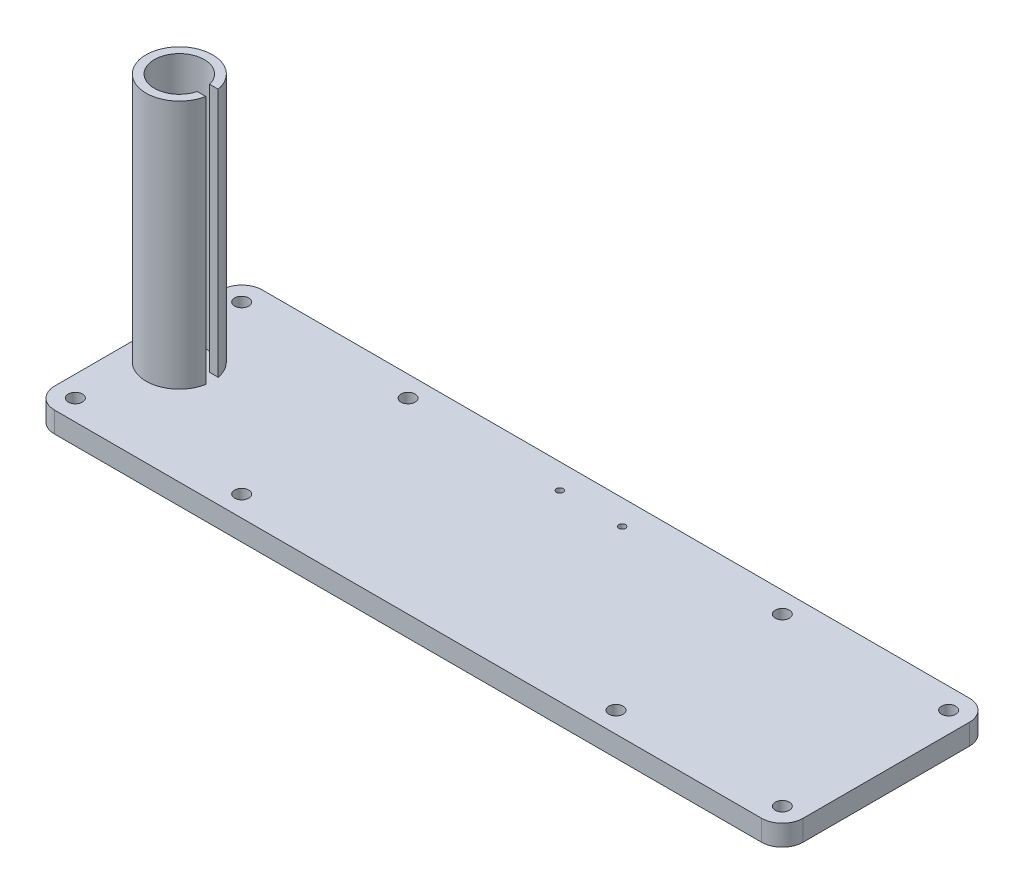
ISO-10303-21;
HEADER;
FILE_DESCRIPTION(('STEP AP214'),'2;1');
FILE_NAME('part.step','',(''),(''),'','','');
FILE_SCHEMA(('AUTOMOTIVE_DESIGN { 1 0 10303 214 1 1 1 1 }'));
ENDSEC;
DATA;
#1=APPLICATION_CONTEXT('core data for automotive mechanical design processes');
#2=APPLICATION_PROTOCOL_DEFINITION('international standard','automotive_design',2000,#1);
#3=PRODUCT_CONTEXT('',#1,'mechanical');
#4=PRODUCT('Part','Part','',(#3));
#5=PRODUCT_RELATED_PRODUCT_CATEGORY('part','',(#4));
#6=PRODUCT_DEFINITION_FORMATION('','',#4);
#7=PRODUCT_DEFINITION_CONTEXT('part definition',#1,'design');
#8=PRODUCT_DEFINITION('design','',#6,#7);
#9=PRODUCT_DEFINITION_SHAPE('','',#8);
#10=(LENGTH_UNIT() NAMED_UNIT(*) SI_UNIT(.MILLI.,.METRE.));
#11=(NAMED_UNIT(*) PLANE_ANGLE_UNIT() SI_UNIT($,.RADIAN.));
#12=(NAMED_UNIT(*) SI_UNIT($,.STERADIAN.) SOLID_ANGLE_UNIT());
#13=UNCERTAINTY_MEASURE_WITH_UNIT(LENGTH_MEASURE(1.E-05),#10,'distance_accuracy_value','');
#14=(GEOMETRIC_REPRESENTATION_CONTEXT(3) GLOBAL_UNCERTAINTY_ASSIGNED_CONTEXT((#13)) GLOBAL_UNIT_ASSIGNED_CONTEXT((#10,
#11,#12)) REPRESENTATION_CONTEXT('',''));
#15=CARTESIAN_POINT('',(0.,0.,0.));
#16=DIRECTION('',(0.,0.,1.));
#17=DIRECTION('',(1.,0.,0.));
#18=AXIS2_PLACEMENT_3D('',#15,#16,#17);
#19=CARTESIAN_POINT('',(0.,5.,25.));
#20=DIRECTION('',(0.,0.,-1.));
#21=DIRECTION('',(-1.,0.,0.));
#22=AXIS2_PLACEMENT_3D('',#19,#20,#21);
#23=PLANE('',#22);
#24=DIRECTION('',(1.,0.,0.));
#25=VECTOR('',#24,1.);
#26=CARTESIAN_POINT('',(0.,0.,25.));
#27=LINE('',#26,#25);
#28=CARTESIAN_POINT('',(-85.,0.,25.));
#29=VERTEX_POINT('',#28);
#30=CARTESIAN_POINT('',(85.,0.,25.));
#31=VERTEX_POINT('',#30);
#32=EDGE_CURVE('E207',#29,#31,#27,.T.);
#33=ORIENTED_EDGE('',*,*,#32,.T.);
#34=DIRECTION('',(0.,-1.,0.));
#35=VECTOR('',#34,1.);
#36=CARTESIAN_POINT('',(85.,5.,25.));
#37=LINE('',#36,#35);
#38=CARTESIAN_POINT('',(85.,5.,25.));
#39=VERTEX_POINT('',#38);
#40=EDGE_CURVE('E68',#39,#31,#37,.T.);
#41=ORIENTED_EDGE('',*,*,#40,.F.);
#42=DIRECTION('',(1.,0.,0.));
#43=VECTOR('',#42,1.);
#44=CARTESIAN_POINT('',(0.,5.,25.));
#45=LINE('',#44,#43);
#46=CARTESIAN_POINT('',(-85.,5.,25.));
#47=VERTEX_POINT('',#46);
#48=EDGE_CURVE('E296',#47,#39,#45,.T.);
#49=ORIENTED_EDGE('',*,*,#48,.F.);
#50=DIRECTION('',(0.,-1.,0.));
#51=VECTOR('',#50,1.);
#52=CARTESIAN_POINT('',(-85.,5.,25.));
#53=LINE('',#52,#51);
#54=EDGE_CURVE('E197',#47,#29,#53,.T.);
#55=ORIENTED_EDGE('',*,*,#54,.T.);
#56=EDGE_LOOP('',(#33,#41,#49,#55));
#57=FACE_BOUND('',#56,.T.);
#58=ADVANCED_FACE('F59',(#57),#23,.F.);
#59=CARTESIAN_POINT('',(85.,5.,20.));
#60=DIRECTION('',(0.,-1.,0.));
#61=DIRECTION('',(0.,0.,-1.));
#62=AXIS2_PLACEMENT_3D('',#59,#60,#61);
#63=CYLINDRICAL_SURFACE('',#62,5.);
#64=CARTESIAN_POINT('',(85.,0.,20.));
#65=DIRECTION('',(0.,1.,0.));
#66=DIRECTION('',(0.,0.,1.));
#67=AXIS2_PLACEMENT_3D('',#64,#65,#66);
#68=CIRCLE('',#67,5.);
#69=CARTESIAN_POINT('',(90.,0.,20.));
#70=VERTEX_POINT('',#69);
#71=EDGE_CURVE('E211',#31,#70,#68,.T.);
#72=ORIENTED_EDGE('',*,*,#71,.T.);
#73=DIRECTION('',(0.,-1.,0.));
#74=VECTOR('',#73,1.);
#75=CARTESIAN_POINT('',(90.,5.,20.));
#76=LINE('',#75,#74);
#77=CARTESIAN_POINT('',(90.,5.,20.));
#78=VERTEX_POINT('',#77);
#79=EDGE_CURVE('E271',#78,#70,#76,.T.);
#80=ORIENTED_EDGE('',*,*,#79,.F.);
#81=CARTESIAN_POINT('',(85.,5.,20.));
#82=DIRECTION('',(0.,1.,0.));
#83=DIRECTION('',(0.,0.,1.));
#84=AXIS2_PLACEMENT_3D('',#81,#82,#83);
#85=CIRCLE('',#84,5.);
#86=EDGE_CURVE('E126',#39,#78,#85,.T.);
#87=ORIENTED_EDGE('',*,*,#86,.F.);
#88=ORIENTED_EDGE('',*,*,#40,.T.);
#89=EDGE_LOOP('',(#72,#80,#87,#88));
#90=FACE_BOUND('',#89,.T.);
#91=ADVANCED_FACE('F275',(#90),#63,.T.);
#92=CARTESIAN_POINT('',(90.,5.,0.));
#93=DIRECTION('',(1.,0.,0.));
#94=DIRECTION('',(0.,0.,-1.));
#95=AXIS2_PLACEMENT_3D('',#92,#93,#94);
#96=PLANE('',#95);
#97=DIRECTION('',(0.,0.,1.));
#98=VECTOR('',#97,1.);
#99=CARTESIAN_POINT('',(90.,0.,0.));
#100=LINE('',#99,#98);
#101=CARTESIAN_POINT('',(90.,0.,-20.));
#102=VERTEX_POINT('',#101);
#103=EDGE_CURVE('E215',#102,#70,#100,.T.);
#104=ORIENTED_EDGE('',*,*,#103,.F.);
#105=DIRECTION('',(0.,-1.,0.));
#106=VECTOR('',#105,1.);
#107=CARTESIAN_POINT('',(90.,5.,-20.));
#108=LINE('',#107,#106);
#109=CARTESIAN_POINT('',(90.,5.,-20.));
#110=VERTEX_POINT('',#109);
#111=EDGE_CURVE('E268',#110,#102,#108,.T.);
#112=ORIENTED_EDGE('',*,*,#111,.F.);
#113=DIRECTION('',(0.,0.,1.));
#114=VECTOR('',#113,1.);
#115=CARTESIAN_POINT('',(90.,5.,0.));
#116=LINE('',#115,#114);
#117=EDGE_CURVE('E288',#110,#78,#116,.T.);
#118=ORIENTED_EDGE('',*,*,#117,.T.);
#119=ORIENTED_EDGE('',*,*,#79,.T.);
#120=EDGE_LOOP('',(#104,#112,#118,#119));
#121=FACE_BOUND('',#120,.T.);
#122=ADVANCED_FACE('F285',(#121),#96,.T.);
#123=CARTESIAN_POINT('',(85.,5.,-20.));
#124=DIRECTION('',(0.,-1.,0.));
#125=DIRECTION('',(0.,0.,-1.));
#126=AXIS2_PLACEMENT_3D('',#123,#124,#125);
#127=CYLINDRICAL_SURFACE('',#126,5.);
#128=CARTESIAN_POINT('',(85.,0.,-20.));
#129=DIRECTION('',(0.,1.,0.));
#130=DIRECTION('',(0.,0.,1.));
#131=AXIS2_PLACEMENT_3D('',#128,#129,#130);
#132=CIRCLE('',#131,5.);
#133=CARTESIAN_POINT('',(85.,0.,-25.));
#134=VERTEX_POINT('',#133);
#135=EDGE_CURVE('E219',#134,#102,#132,.F.);
#136=ORIENTED_EDGE('',*,*,#135,.F.);
#137=DIRECTION('',(0.,-1.,0.));
#138=VECTOR('',#137,1.);
#139=CARTESIAN_POINT('',(85.,5.,-25.));
#140=LINE('',#139,#138);
#141=CARTESIAN_POINT('',(85.,5.,-25.));
#142=VERTEX_POINT('',#141);
#143=EDGE_CURVE('E265',#142,#134,#140,.T.);
#144=ORIENTED_EDGE('',*,*,#143,.F.);
#145=CARTESIAN_POINT('',(85.,5.,-20.));
#146=DIRECTION('',(0.,1.,0.));
#147=DIRECTION('',(0.,0.,1.));
#148=AXIS2_PLACEMENT_3D('',#145,#146,#147);
#149=CIRCLE('',#148,5.);
#150=EDGE_CURVE('E291',#142,#110,#149,.F.);
#151=ORIENTED_EDGE('',*,*,#150,.T.);
#152=ORIENTED_EDGE('',*,*,#111,.T.);
#153=EDGE_LOOP('',(#136,#144,#151,#152));
#154=FACE_BOUND('',#153,.T.);
#155=ADVANCED_FACE('F474',(#154),#127,.T.);
#156=CARTESIAN_POINT('',(0.,5.,-25.));
#157=DIRECTION('',(0.,0.,-1.));
#158=DIRECTION('',(-1.,0.,0.));
#159=AXIS2_PLACEMENT_3D('',#156,#157,#158);
#160=PLANE('',#159);
#161=DIRECTION('',(1.,0.,0.));
#162=VECTOR('',#161,1.);
#163=CARTESIAN_POINT('',(0.,0.,-25.));
#164=LINE('',#163,#162);
#165=CARTESIAN_POINT('',(-85.,0.,-25.));
#166=VERTEX_POINT('',#165);
#167=EDGE_CURVE('E223',#166,#134,#164,.T.);
#168=ORIENTED_EDGE('',*,*,#167,.F.);
#169=DIRECTION('',(0.,-1.,0.));
#170=VECTOR('',#169,1.);
#171=CARTESIAN_POINT('',(-85.,5.,-25.));
#172=LINE('',#171,#170);
#173=CARTESIAN_POINT('',(-85.,5.,-25.));
#174=VERTEX_POINT('',#173);
#175=EDGE_CURVE('E163',#174,#166,#172,.T.);
#176=ORIENTED_EDGE('',*,*,#175,.F.);
#177=DIRECTION('',(1.,0.,0.));
#178=VECTOR('',#177,1.);
#179=CARTESIAN_POINT('',(0.,5.,-25.));
#180=LINE('',#179,#178);
#181=EDGE_CURVE('E151',#174,#142,#180,.T.);
#182=ORIENTED_EDGE('',*,*,#181,.T.);
#183=ORIENTED_EDGE('',*,*,#143,.T.);
#184=EDGE_LOOP('',(#168,#176,#182,#183));
#185=FACE_BOUND('',#184,.T.);
#186=ADVANCED_FACE('F302',(#185),#160,.T.);
#187=CARTESIAN_POINT('',(-85.,5.,-20.));
#188=DIRECTION('',(0.,-1.,0.));
#189=DIRECTION('',(0.,0.,-1.));
#190=AXIS2_PLACEMENT_3D('',#187,#188,#189);
#191=CYLINDRICAL_SURFACE('',#190,5.);
#192=CARTESIAN_POINT('',(-85.,0.,-20.));
#193=DIRECTION('',(0.,1.,0.));
#194=DIRECTION('',(0.,0.,1.));
#195=AXIS2_PLACEMENT_3D('',#192,#193,#194);
#196=CIRCLE('',#195,5.);
#197=CARTESIAN_POINT('',(-90.,0.,-20.));
#198=VERTEX_POINT('',#197);
#199=EDGE_CURVE('E159',#166,#198,#196,.T.);
#200=ORIENTED_EDGE('',*,*,#199,.T.);
#201=DIRECTION('',(0.,-1.,0.));
#202=VECTOR('',#201,1.);
#203=CARTESIAN_POINT('',(-90.,5.,-20.));
#204=LINE('',#203,#202);
#205=CARTESIAN_POINT('',(-90.,5.,-20.));
#206=VERTEX_POINT('',#205);
#207=EDGE_CURVE('E156',#206,#198,#204,.T.);
#208=ORIENTED_EDGE('',*,*,#207,.F.);
#209=CARTESIAN_POINT('',(-85.,5.,-20.));
#210=DIRECTION('',(0.,1.,0.));
#211=DIRECTION('',(0.,0.,1.));
#212=AXIS2_PLACEMENT_3D('',#209,#210,#211);
#213=CIRCLE('',#212,5.);
#214=EDGE_CURVE('E142',#174,#206,#213,.T.);
#215=ORIENTED_EDGE('',*,*,#214,.F.);
#216=ORIENTED_EDGE('',*,*,#175,.T.);
#217=EDGE_LOOP('',(#200,#208,#215,#216));
#218=FACE_BOUND('',#217,.T.);
#219=ADVANCED_FACE('F157',(#218),#191,.T.);
#220=CARTESIAN_POINT('',(-90.,5.,0.));
#221=DIRECTION('',(1.,0.,0.));
#222=DIRECTION('',(0.,0.,-1.));
#223=AXIS2_PLACEMENT_3D('',#220,#221,#222);
#224=PLANE('',#223);
#225=DIRECTION('',(0.,0.,1.));
#226=VECTOR('',#225,1.);
#227=CARTESIAN_POINT('',(-90.,0.,0.));
#228=LINE('',#227,#226);
#229=CARTESIAN_POINT('',(-90.,0.,20.));
#230=VERTEX_POINT('',#229);
#231=EDGE_CURVE('E229',#198,#230,#228,.T.);
#232=ORIENTED_EDGE('',*,*,#231,.T.);
#233=DIRECTION('',(0.,-1.,0.));
#234=VECTOR('',#233,1.);
#235=CARTESIAN_POINT('',(-90.,5.,20.));
#236=LINE('',#235,#234);
#237=CARTESIAN_POINT('',(-90.,5.,20.));
#238=VERTEX_POINT('',#237);
#239=EDGE_CURVE('E164',#238,#230,#236,.T.);
#240=ORIENTED_EDGE('',*,*,#239,.F.);
#241=DIRECTION('',(0.,0.,1.));
#242=VECTOR('',#241,1.);
#243=CARTESIAN_POINT('',(-90.,5.,0.));
#244=LINE('',#243,#242);
#245=EDGE_CURVE('E147',#206,#238,#244,.T.);
#246=ORIENTED_EDGE('',*,*,#245,.F.);
#247=ORIENTED_EDGE('',*,*,#207,.T.);
#248=EDGE_LOOP('',(#232,#240,#246,#247));
#249=FACE_BOUND('',#248,.T.);
#250=ADVANCED_FACE('F166',(#249),#224,.F.);
#251=CARTESIAN_POINT('',(85.,5.,20.));
#252=DIRECTION('',(0.,-1.,0.));
#253=DIRECTION('',(0.,0.,-1.));
#254=AXIS2_PLACEMENT_3D('',#251,#252,#253);
#255=CYLINDRICAL_SURFACE('',#254,1.7);
#256=CARTESIAN_POINT('',(85.,5.,20.));
#257=DIRECTION('',(0.,1.,0.));
#258=DIRECTION('',(0.,0.,1.));
#259=AXIS2_PLACEMENT_3D('',#256,#257,#258);
#260=CIRCLE('',#259,1.7);
#261=CARTESIAN_POINT('',(85.,5.,21.7));
#262=VERTEX_POINT('',#261);
#263=EDGE_CURVE('E189',#262,#262,#260,.T.);
#264=ORIENTED_EDGE('',*,*,#263,.T.);
#265=EDGE_LOOP('',(#264));
#266=FACE_BOUND('',#265,.T.);
#267=CARTESIAN_POINT('',(85.,0.,20.));
#268=DIRECTION('',(0.,1.,0.));
#269=DIRECTION('',(0.,0.,1.));
#270=AXIS2_PLACEMENT_3D('',#267,#268,#269);
#271=CIRCLE('',#270,1.7);
#272=CARTESIAN_POINT('',(85.,0.,21.7));
#273=VERTEX_POINT('',#272);
#274=EDGE_CURVE('E250',#273,#273,#271,.T.);
#275=ORIENTED_EDGE('',*,*,#274,.F.);
#276=EDGE_LOOP('',(#275));
#277=FACE_BOUND('',#276,.T.);
#278=ADVANCED_FACE('F449',(#266,#277),#255,.F.);
#279=CARTESIAN_POINT('',(-85.,5.,-20.));
#280=DIRECTION('',(0.,-1.,0.));
#281=DIRECTION('',(0.,0.,-1.));
#282=AXIS2_PLACEMENT_3D('',#279,#280,#281);
#283=CYLINDRICAL_SURFACE('',#282,1.7);
#284=CARTESIAN_POINT('',(-85.,5.,-20.));
#285=DIRECTION('',(0.,1.,0.));
#286=DIRECTION('',(0.,0.,1.));
#287=AXIS2_PLACEMENT_3D('',#284,#285,#286);
#288=CIRCLE('',#287,1.7);
#289=CARTESIAN_POINT('',(-85.,5.,-18.3));
#290=VERTEX_POINT('',#289);
#291=EDGE_CURVE('E185',#290,#290,#288,.T.);
#292=ORIENTED_EDGE('',*,*,#291,.T.);
#293=EDGE_LOOP('',(#292));
#294=FACE_BOUND('',#293,.T.);
#295=CARTESIAN_POINT('',(-85.,0.,-20.));
#296=DIRECTION('',(0.,1.,0.));
#297=DIRECTION('',(0.,0.,1.));
#298=AXIS2_PLACEMENT_3D('',#295,#296,#297);
#299=CIRCLE('',#298,1.7);
#300=CARTESIAN_POINT('',(-85.,0.,-18.3));
#301=VERTEX_POINT('',#300);
#302=EDGE_CURVE('E246',#301,#301,#299,.T.);
#303=ORIENTED_EDGE('',*,*,#302,.F.);
#304=EDGE_LOOP('',(#303));
#305=FACE_BOUND('',#304,.T.);
#306=ADVANCED_FACE('F452',(#294,#305),#283,.F.);
#307=CARTESIAN_POINT('',(-85.,5.,20.));
#308=DIRECTION('',(0.,-1.,0.));
#309=DIRECTION('',(0.,0.,-1.));
#310=AXIS2_PLACEMENT_3D('',#307,#308,#309);
#311=CYLINDRICAL_SURFACE('',#310,1.7);
#312=CARTESIAN_POINT('',(-85.,5.,20.));
#313=DIRECTION('',(0.,1.,0.));
#314=DIRECTION('',(0.,0.,1.));
#315=AXIS2_PLACEMENT_3D('',#312,#313,#314);
#316=CIRCLE('',#315,1.7);
#317=CARTESIAN_POINT('',(-85.,5.,21.7));
#318=VERTEX_POINT('',#317);
#319=EDGE_CURVE('E181',#318,#318,#316,.T.);
#320=ORIENTED_EDGE('',*,*,#319,.T.);
#321=EDGE_LOOP('',(#320));
#322=FACE_BOUND('',#321,.T.);
#323=CARTESIAN_POINT('',(-85.,0.,20.));
#324=DIRECTION('',(0.,1.,0.));
#325=DIRECTION('',(0.,0.,1.));
#326=AXIS2_PLACEMENT_3D('',#323,#324,#325);
#327=CIRCLE('',#326,1.7);
#328=CARTESIAN_POINT('',(-85.,0.,21.7));
#329=VERTEX_POINT('',#328);
#330=EDGE_CURVE('E242',#329,#329,#327,.T.);
#331=ORIENTED_EDGE('',*,*,#330,.F.);
#332=EDGE_LOOP('',(#331));
#333=FACE_BOUND('',#332,.T.);
#334=ADVANCED_FACE('F456',(#322,#333),#311,.F.);
#335=CARTESIAN_POINT('',(-45.,5.,20.));
#336=DIRECTION('',(0.,-1.,0.));
#337=DIRECTION('',(0.,0.,-1.));
#338=AXIS2_PLACEMENT_3D('',#335,#336,#337);
#339=CYLINDRICAL_SURFACE('',#338,1.7);
#340=CARTESIAN_POINT('',(-45.,5.,20.));
#341=DIRECTION('',(0.,1.,0.));
#342=DIRECTION('',(0.,0.,1.));
#343=AXIS2_PLACEMENT_3D('',#340,#341,#342);
#344=CIRCLE('',#343,1.7);
#345=CARTESIAN_POINT('',(-45.,5.,21.7));
#346=VERTEX_POINT('',#345);
#347=EDGE_CURVE('E177',#346,#346,#344,.F.);
#348=ORIENTED_EDGE('',*,*,#347,.F.);
#349=EDGE_LOOP('',(#348));
#350=FACE_BOUND('',#349,.T.);
#351=CARTESIAN_POINT('',(-45.,0.,20.));
#352=DIRECTION('',(0.,1.,0.));
#353=DIRECTION('',(0.,0.,1.));
#354=AXIS2_PLACEMENT_3D('',#351,#352,#353);
#355=CIRCLE('',#354,1.7);
#356=CARTESIAN_POINT('',(-45.,0.,21.7));
#357=VERTEX_POINT('',#356);
#358=EDGE_CURVE('E238',#357,#357,#355,.F.);
#359=ORIENTED_EDGE('',*,*,#358,.T.);
#360=EDGE_LOOP('',(#359));
#361=FACE_BOUND('',#360,.T.);
#362=ADVANCED_FACE('F460',(#350,#361),#339,.F.);
#363=CARTESIAN_POINT('',(44.9999999999999,5.,20.));
#364=DIRECTION('',(0.,-1.,0.));
#365=DIRECTION('',(0.,0.,-1.));
#366=AXIS2_PLACEMENT_3D('',#363,#364,#365);
#367=CYLINDRICAL_SURFACE('',#366,1.7);
#368=CARTESIAN_POINT('',(44.9999999999999,5.,20.));
#369=DIRECTION('',(0.,1.,0.));
#370=DIRECTION('',(0.,0.,1.));
#371=AXIS2_PLACEMENT_3D('',#368,#369,#370);
#372=CIRCLE('',#371,1.7);
#373=CARTESIAN_POINT('',(44.9999999999999,5.,21.7));
#374=VERTEX_POINT('',#373);
#375=EDGE_CURVE('E170',#374,#374,#372,.T.);
#376=ORIENTED_EDGE('',*,*,#375,.T.);
#377=EDGE_LOOP('',(#376));
#378=FACE_BOUND('',#377,.T.);
#379=CARTESIAN_POINT('',(44.9999999999999,0.,20.));
#380=DIRECTION('',(0.,1.,0.));
#381=DIRECTION('',(0.,0.,1.));
#382=AXIS2_PLACEMENT_3D('',#379,#380,#381);
#383=CIRCLE('',#382,1.7);
#384=CARTESIAN_POINT('',(44.9999999999999,0.,21.7));
#385=VERTEX_POINT('',#384);
#386=EDGE_CURVE('E234',#385,#385,#383,.T.);
#387=ORIENTED_EDGE('',*,*,#386,.F.);
#388=EDGE_LOOP('',(#387));
#389=FACE_BOUND('',#388,.T.);
#390=ADVANCED_FACE('F428',(#378,#389),#367,.F.);
#391=CARTESIAN_POINT('',(-85.,5.,20.));
#392=DIRECTION('',(0.,-1.,0.));
#393=DIRECTION('',(0.,0.,-1.));
#394=AXIS2_PLACEMENT_3D('',#391,#392,#393);
#395=CYLINDRICAL_SURFACE('',#394,5.);
#396=CARTESIAN_POINT('',(-85.,0.,20.));
#397=DIRECTION('',(0.,1.,0.));
#398=DIRECTION('',(0.,0.,1.));
#399=AXIS2_PLACEMENT_3D('',#396,#397,#398);
#400=CIRCLE('',#399,5.);
#401=EDGE_CURVE('E117',#230,#29,#400,.T.);
#402=ORIENTED_EDGE('',*,*,#401,.T.);
#403=ORIENTED_EDGE('',*,*,#54,.F.);
#404=CARTESIAN_POINT('',(-85.,5.,20.));
#405=DIRECTION('',(0.,1.,0.));
#406=DIRECTION('',(0.,0.,1.));
#407=AXIS2_PLACEMENT_3D('',#404,#405,#406);
#408=CIRCLE('',#407,5.);
#409=EDGE_CURVE('E84',#238,#47,#408,.T.);
#410=ORIENTED_EDGE('',*,*,#409,.F.);
#411=ORIENTED_EDGE('',*,*,#239,.T.);
#412=EDGE_LOOP('',(#402,#403,#410,#411));
#413=FACE_BOUND('',#412,.T.);
#414=ADVANCED_FACE('F303',(#413),#395,.T.);
#415=CARTESIAN_POINT('',(-45.,5.,-20.));
#416=DIRECTION('',(0.,-1.,0.));
#417=DIRECTION('',(0.,0.,-1.));
#418=AXIS2_PLACEMENT_3D('',#415,#416,#417);
#419=CYLINDRICAL_SURFACE('',#418,1.7);
#420=CARTESIAN_POINT('',(-45.,5.,-20.));
#421=DIRECTION('',(0.,1.,0.));
#422=DIRECTION('',(0.,0.,1.));
#423=AXIS2_PLACEMENT_3D('',#420,#421,#422);
#424=CIRCLE('',#423,1.7);
#425=CARTESIAN_POINT('',(-45.,5.,-18.3));
#426=VERTEX_POINT('',#425);
#427=EDGE_CURVE('E305',#426,#426,#424,.T.);
#428=ORIENTED_EDGE('',*,*,#427,.T.);
#429=EDGE_LOOP('',(#428));
#430=FACE_BOUND('',#429,.T.);
#431=CARTESIAN_POINT('',(-45.,0.,-20.));
#432=DIRECTION('',(0.,1.,0.));
#433=DIRECTION('',(0.,0.,1.));
#434=AXIS2_PLACEMENT_3D('',#431,#432,#433);
#435=CIRCLE('',#434,1.7);
#436=CARTESIAN_POINT('',(-45.,0.,-18.3));
#437=VERTEX_POINT('',#436);
#438=EDGE_CURVE('E202',#437,#437,#435,.T.);
#439=ORIENTED_EDGE('',*,*,#438,.F.);
#440=EDGE_LOOP('',(#439));
#441=FACE_BOUND('',#440,.T.);
#442=ADVANCED_FACE('F419',(#430,#441),#419,.F.);
#443=CARTESIAN_POINT('',(45.,5.,-20.));
#444=DIRECTION('',(0.,-1.,0.));
#445=DIRECTION('',(0.,0.,-1.));
#446=AXIS2_PLACEMENT_3D('',#443,#444,#445);
#447=CYLINDRICAL_SURFACE('',#446,1.7);
#448=CARTESIAN_POINT('',(45.,5.,-20.));
#449=DIRECTION('',(0.,1.,0.));
#450=DIRECTION('',(0.,0.,1.));
#451=AXIS2_PLACEMENT_3D('',#448,#449,#450);
#452=CIRCLE('',#451,1.7);
#453=CARTESIAN_POINT('',(45.,5.,-18.3));
#454=VERTEX_POINT('',#453);
#455=EDGE_CURVE('E258',#454,#454,#452,.F.);
#456=ORIENTED_EDGE('',*,*,#455,.F.);
#457=EDGE_LOOP('',(#456));
#458=FACE_BOUND('',#457,.T.);
#459=CARTESIAN_POINT('',(45.,0.,-20.));
#460=DIRECTION('',(0.,1.,0.));
#461=DIRECTION('',(0.,0.,1.));
#462=AXIS2_PLACEMENT_3D('',#459,#460,#461);
#463=CIRCLE('',#462,1.7);
#464=CARTESIAN_POINT('',(45.,0.,-18.3));
#465=VERTEX_POINT('',#464);
#466=EDGE_CURVE('E198',#465,#465,#463,.F.);
#467=ORIENTED_EDGE('',*,*,#466,.T.);
#468=EDGE_LOOP('',(#467));
#469=FACE_BOUND('',#468,.T.);
#470=ADVANCED_FACE('F61',(#458,#469),#447,.F.);
#471=CARTESIAN_POINT('',(85.,5.,-20.));
#472=DIRECTION('',(0.,-1.,0.));
#473=DIRECTION('',(0.,0.,-1.));
#474=AXIS2_PLACEMENT_3D('',#471,#472,#473);
#475=CYLINDRICAL_SURFACE('',#474,1.7);
#476=CARTESIAN_POINT('',(85.,5.,-20.));
#477=DIRECTION('',(0.,1.,0.));
#478=DIRECTION('',(0.,0.,1.));
#479=AXIS2_PLACEMENT_3D('',#476,#477,#478);
#480=CIRCLE('',#479,1.7);
#481=CARTESIAN_POINT('',(85.,5.,-18.3));
#482=VERTEX_POINT('',#481);
#483=EDGE_CURVE('E193',#482,#482,#480,.T.);
#484=ORIENTED_EDGE('',*,*,#483,.T.);
#485=EDGE_LOOP('',(#484));
#486=FACE_BOUND('',#485,.T.);
#487=CARTESIAN_POINT('',(85.,0.,-20.));
#488=DIRECTION('',(0.,1.,0.));
#489=DIRECTION('',(0.,0.,1.));
#490=AXIS2_PLACEMENT_3D('',#487,#488,#489);
#491=CIRCLE('',#490,1.7);
#492=CARTESIAN_POINT('',(85.,0.,-18.3));
#493=VERTEX_POINT('',#492);
#494=EDGE_CURVE('E254',#493,#493,#491,.T.);
#495=ORIENTED_EDGE('',*,*,#494,.F.);
#496=EDGE_LOOP('',(#495));
#497=FACE_BOUND('',#496,.T.);
#498=ADVANCED_FACE('F426',(#486,#497),#475,.F.);
#499=CARTESIAN_POINT('',(0.,5.,0.));
#500=DIRECTION('',(0.,1.,0.));
#501=DIRECTION('',(0.,0.,1.));
#502=AXIS2_PLACEMENT_3D('',#499,#500,#501);
#503=PLANE('',#502);
#504=CARTESIAN_POINT('',(-80.,5.,0.));
#505=DIRECTION('',(0.,1.,0.));
#506=DIRECTION('',(1.,0.,0.));
#507=AXIS2_PLACEMENT_3D('',#504,#505,#506);
#508=CIRCLE('',#507,8.);
#509=CARTESIAN_POINT('',(-72.1418831772491,5.,-1.5));
#510=VERTEX_POINT('',#509);
#511=CARTESIAN_POINT('',(-72.1418831772491,5.,1.5));
#512=VERTEX_POINT('',#511);
#513=EDGE_CURVE('E329',#510,#512,#508,.T.);
#514=ORIENTED_EDGE('',*,*,#513,.F.);
#515=DIRECTION('',(1.,0.,0.));
#516=VECTOR('',#515,1.);
#517=CARTESIAN_POINT('',(-74.1905249806888,5.,-1.5));
#518=LINE('',#517,#516);
#519=CARTESIAN_POINT('',(-74.1905249806888,5.,-1.5));
#520=VERTEX_POINT('',#519);
#521=EDGE_CURVE('E344',#520,#510,#518,.T.);
#522=ORIENTED_EDGE('',*,*,#521,.F.);
#523=CARTESIAN_POINT('',(-80.,5.,0.));
#524=DIRECTION('',(0.,1.,0.));
#525=DIRECTION('',(0.,0.,1.));
#526=AXIS2_PLACEMENT_3D('',#523,#524,#525);
#527=CIRCLE('',#526,6.);
#528=CARTESIAN_POINT('',(-74.1905249806888,5.,1.5));
#529=VERTEX_POINT('',#528);
#530=EDGE_CURVE('E12',#529,#520,#527,.F.);
#531=ORIENTED_EDGE('',*,*,#530,.F.);
#532=DIRECTION('',(-1.,0.,0.));
#533=VECTOR('',#532,1.);
#534=CARTESIAN_POINT('',(-74.1905249806888,5.,1.5));
#535=LINE('',#534,#533);
#536=EDGE_CURVE('E340',#512,#529,#535,.T.);
#537=ORIENTED_EDGE('',*,*,#536,.F.);
#538=EDGE_LOOP('',(#514,#522,#531,#537));
#539=FACE_BOUND('',#538,.T.);
#540=CARTESIAN_POINT('',(7.5,5.,-19.));
#541=DIRECTION('',(0.,1.,0.));
#542=DIRECTION('',(0.,0.,1.));
#543=AXIS2_PLACEMENT_3D('',#540,#541,#542);
#544=CIRCLE('',#543,0.799999999999988);
#545=CARTESIAN_POINT('',(7.5,5.,-18.2));
#546=VERTEX_POINT('',#545);
#547=EDGE_CURVE('E324',#546,#546,#544,.T.);
#548=ORIENTED_EDGE('',*,*,#547,.F.);
#549=EDGE_LOOP('',(#548));
#550=FACE_BOUND('',#549,.T.);
#551=CARTESIAN_POINT('',(-7.5,5.,-19.));
#552=DIRECTION('',(0.,1.,0.));
#553=DIRECTION('',(0.,0.,1.));
#554=AXIS2_PLACEMENT_3D('',#551,#552,#553);
#555=CIRCLE('',#554,0.799999999999988);
#556=CARTESIAN_POINT('',(-7.5,5.,-18.2));
#557=VERTEX_POINT('',#556);
#558=EDGE_CURVE('E316',#557,#557,#555,.T.);
#559=ORIENTED_EDGE('',*,*,#558,.F.);
#560=EDGE_LOOP('',(#559));
#561=FACE_BOUND('',#560,.T.);
#562=ORIENTED_EDGE('',*,*,#455,.T.);
#563=EDGE_LOOP('',(#562));
#564=FACE_BOUND('',#563,.T.);
#565=ORIENTED_EDGE('',*,*,#427,.F.);
#566=EDGE_LOOP('',(#565));
#567=FACE_BOUND('',#566,.T.);
#568=ORIENTED_EDGE('',*,*,#48,.T.);
#569=ORIENTED_EDGE('',*,*,#86,.T.);
#570=ORIENTED_EDGE('',*,*,#117,.F.);
#571=ORIENTED_EDGE('',*,*,#150,.F.);
#572=ORIENTED_EDGE('',*,*,#181,.F.);
#573=ORIENTED_EDGE('',*,*,#214,.T.);
#574=ORIENTED_EDGE('',*,*,#245,.T.);
#575=ORIENTED_EDGE('',*,*,#409,.T.);
#576=EDGE_LOOP('',(#568,#569,#570,#571,#572,#573,#574,#575));
#577=FACE_BOUND('',#576,.T.);
#578=ORIENTED_EDGE('',*,*,#375,.F.);
#579=EDGE_LOOP('',(#578));
#580=FACE_BOUND('',#579,.T.);
#581=ORIENTED_EDGE('',*,*,#347,.T.);
#582=EDGE_LOOP('',(#581));
#583=FACE_BOUND('',#582,.T.);
#584=ORIENTED_EDGE('',*,*,#319,.F.);
#585=EDGE_LOOP('',(#584));
#586=FACE_BOUND('',#585,.T.);
#587=ORIENTED_EDGE('',*,*,#291,.F.);
#588=EDGE_LOOP('',(#587));
#589=FACE_BOUND('',#588,.T.);
#590=ORIENTED_EDGE('',*,*,#263,.F.);
#591=EDGE_LOOP('',(#590));
#592=FACE_BOUND('',#591,.T.);
#593=ORIENTED_EDGE('',*,*,#483,.F.);
#594=EDGE_LOOP('',(#593));
#595=FACE_BOUND('',#594,.T.);
#596=ADVANCED_FACE('F144',(#539,#550,#561,#564,#567,#577,#580,#583,#586,#589,#592,#595),#503,.T.);
#597=CARTESIAN_POINT('',(0.,0.,0.));
#598=DIRECTION('',(0.,1.,0.));
#599=DIRECTION('',(0.,0.,1.));
#600=AXIS2_PLACEMENT_3D('',#597,#598,#599);
#601=PLANE('',#600);
#602=CARTESIAN_POINT('',(7.5,0.,-19.));
#603=DIRECTION('',(0.,1.,0.));
#604=DIRECTION('',(0.,0.,1.));
#605=AXIS2_PLACEMENT_3D('',#602,#603,#604);
#606=CIRCLE('',#605,0.799999999999997);
#607=CARTESIAN_POINT('',(7.5,0.,-18.2));
#608=VERTEX_POINT('',#607);
#609=EDGE_CURVE('E320',#608,#608,#606,.T.);
#610=ORIENTED_EDGE('',*,*,#609,.T.);
#611=EDGE_LOOP('',(#610));
#612=FACE_BOUND('',#611,.T.);
#613=CARTESIAN_POINT('',(-7.5,0.,-19.));
#614=DIRECTION('',(0.,1.,0.));
#615=DIRECTION('',(0.,0.,1.));
#616=AXIS2_PLACEMENT_3D('',#613,#614,#615);
#617=CIRCLE('',#616,0.799999999999998);
#618=CARTESIAN_POINT('',(-7.5,0.,-18.2));
#619=VERTEX_POINT('',#618);
#620=EDGE_CURVE('E203',#619,#619,#617,.T.);
#621=ORIENTED_EDGE('',*,*,#620,.T.);
#622=EDGE_LOOP('',(#621));
#623=FACE_BOUND('',#622,.T.);
#624=ORIENTED_EDGE('',*,*,#466,.F.);
#625=EDGE_LOOP('',(#624));
#626=FACE_BOUND('',#625,.T.);
#627=ORIENTED_EDGE('',*,*,#438,.T.);
#628=EDGE_LOOP('',(#627));
#629=FACE_BOUND('',#628,.T.);
#630=ORIENTED_EDGE('',*,*,#32,.F.);
#631=ORIENTED_EDGE('',*,*,#401,.F.);
#632=ORIENTED_EDGE('',*,*,#231,.F.);
#633=ORIENTED_EDGE('',*,*,#199,.F.);
#634=ORIENTED_EDGE('',*,*,#167,.T.);
#635=ORIENTED_EDGE('',*,*,#135,.T.);
#636=ORIENTED_EDGE('',*,*,#103,.T.);
#637=ORIENTED_EDGE('',*,*,#71,.F.);
#638=EDGE_LOOP('',(#630,#631,#632,#633,#634,#635,#636,#637));
#639=FACE_BOUND('',#638,.T.);
#640=ORIENTED_EDGE('',*,*,#386,.T.);
#641=EDGE_LOOP('',(#640));
#642=FACE_BOUND('',#641,.T.);
#643=ORIENTED_EDGE('',*,*,#358,.F.);
#644=EDGE_LOOP('',(#643));
#645=FACE_BOUND('',#644,.T.);
#646=ORIENTED_EDGE('',*,*,#330,.T.);
#647=EDGE_LOOP('',(#646));
#648=FACE_BOUND('',#647,.T.);
#649=ORIENTED_EDGE('',*,*,#302,.T.);
#650=EDGE_LOOP('',(#649));
#651=FACE_BOUND('',#650,.T.);
#652=ORIENTED_EDGE('',*,*,#274,.T.);
#653=EDGE_LOOP('',(#652));
#654=FACE_BOUND('',#653,.T.);
#655=ORIENTED_EDGE('',*,*,#494,.T.);
#656=EDGE_LOOP('',(#655));
#657=FACE_BOUND('',#656,.T.);
#658=ADVANCED_FACE('F280',(#612,#623,#626,#629,#639,#642,#645,#648,#651,#654,#657),#601,.F.);
#659=CARTESIAN_POINT('',(-7.5,5.,-19.));
#660=DIRECTION('',(0.,1.,0.));
#661=DIRECTION('',(0.,0.,1.));
#662=AXIS2_PLACEMENT_3D('',#659,#660,#661);
#663=CYLINDRICAL_SURFACE('',#662,0.799999999999993);
#664=ORIENTED_EDGE('',*,*,#620,.F.);
#665=EDGE_LOOP('',(#664));
#666=FACE_BOUND('',#665,.T.);
#667=ORIENTED_EDGE('',*,*,#558,.T.);
#668=EDGE_LOOP('',(#667));
#669=FACE_BOUND('',#668,.T.);
#670=ADVANCED_FACE('F408',(#666,#669),#663,.F.);
#671=CARTESIAN_POINT('',(7.5,5.,-19.));
#672=DIRECTION('',(0.,1.,0.));
#673=DIRECTION('',(0.,0.,1.));
#674=AXIS2_PLACEMENT_3D('',#671,#672,#673);
#675=CYLINDRICAL_SURFACE('',#674,0.799999999999993);
#676=ORIENTED_EDGE('',*,*,#609,.F.);
#677=EDGE_LOOP('',(#676));
#678=FACE_BOUND('',#677,.T.);
#679=ORIENTED_EDGE('',*,*,#547,.T.);
#680=EDGE_LOOP('',(#679));
#681=FACE_BOUND('',#680,.T.);
#682=ADVANCED_FACE('F400',(#678,#681),#675,.F.);
#683=CARTESIAN_POINT('',(-80.,65.,0.));
#684=DIRECTION('',(0.,1.,0.));
#685=DIRECTION('',(0.,0.,1.));
#686=AXIS2_PLACEMENT_3D('',#683,#684,#685);
#687=PLANE('',#686);
#688=DIRECTION('',(-1.,0.,0.));
#689=VECTOR('',#688,1.);
#690=CARTESIAN_POINT('',(-74.1905249806888,65.,-1.5));
#691=LINE('',#690,#689);
#692=CARTESIAN_POINT('',(-72.1418831772491,65.,-1.5));
#693=VERTEX_POINT('',#692);
#694=CARTESIAN_POINT('',(-74.1905249806888,65.,-1.5));
#695=VERTEX_POINT('',#694);
#696=EDGE_CURVE('E350',#693,#695,#691,.T.);
#697=ORIENTED_EDGE('',*,*,#696,.F.);
#698=CARTESIAN_POINT('',(-80.,65.,0.));
#699=DIRECTION('',(0.,1.,0.));
#700=DIRECTION('',(1.,0.,0.));
#701=AXIS2_PLACEMENT_3D('',#698,#699,#700);
#702=CIRCLE('',#701,8.);
#703=CARTESIAN_POINT('',(-72.1418831772491,65.,1.5));
#704=VERTEX_POINT('',#703);
#705=EDGE_CURVE('E328',#693,#704,#702,.T.);
#706=ORIENTED_EDGE('',*,*,#705,.T.);
#707=DIRECTION('',(1.,0.,0.));
#708=VECTOR('',#707,1.);
#709=CARTESIAN_POINT('',(-74.1905249806888,65.,1.5));
#710=LINE('',#709,#708);
#711=CARTESIAN_POINT('',(-74.1905249806888,65.,1.5));
#712=VERTEX_POINT('',#711);
#713=EDGE_CURVE('E362',#712,#704,#710,.T.);
#714=ORIENTED_EDGE('',*,*,#713,.F.);
#715=CARTESIAN_POINT('',(-80.,65.,0.));
#716=DIRECTION('',(0.,1.,0.));
#717=DIRECTION('',(0.,0.,1.));
#718=AXIS2_PLACEMENT_3D('',#715,#716,#717);
#719=CIRCLE('',#718,6.);
#720=EDGE_CURVE('E333',#695,#712,#719,.T.);
#721=ORIENTED_EDGE('',*,*,#720,.F.);
#722=EDGE_LOOP('',(#697,#706,#714,#721));
#723=FACE_BOUND('',#722,.T.);
#724=ADVANCED_FACE('F395',(#723),#687,.T.);
#725=CARTESIAN_POINT('',(-80.,65.,0.));
#726=DIRECTION('',(0.,-1.,0.));
#727=DIRECTION('',(0.,0.,-1.));
#728=AXIS2_PLACEMENT_3D('',#725,#726,#727);
#729=CYLINDRICAL_SURFACE('',#728,8.);
#730=ORIENTED_EDGE('',*,*,#705,.F.);
#731=DIRECTION('',(0.,1.,0.));
#732=VECTOR('',#731,1.);
#733=CARTESIAN_POINT('',(-72.1418831772491,1.2853802763914,-1.5));
#734=LINE('',#733,#732);
#735=EDGE_CURVE('E354',#510,#693,#734,.T.);
#736=ORIENTED_EDGE('',*,*,#735,.F.);
#737=ORIENTED_EDGE('',*,*,#513,.T.);
#738=DIRECTION('',(0.,1.,0.));
#739=VECTOR('',#738,1.);
#740=CARTESIAN_POINT('',(-72.1418831772491,1.2853802763914,1.5));
#741=LINE('',#740,#739);
#742=EDGE_CURVE('E349',#512,#704,#741,.T.);
#743=ORIENTED_EDGE('',*,*,#742,.T.);
#744=EDGE_LOOP('',(#730,#736,#737,#743));
#745=FACE_BOUND('',#744,.T.);
#746=ADVANCED_FACE('F377',(#745),#729,.T.);
#747=CARTESIAN_POINT('',(-80.,65.,0.));
#748=DIRECTION('',(0.,-1.,0.));
#749=DIRECTION('',(0.,0.,-1.));
#750=AXIS2_PLACEMENT_3D('',#747,#748,#749);
#751=CYLINDRICAL_SURFACE('',#750,6.);
#752=DIRECTION('',(0.,1.,0.));
#753=VECTOR('',#752,1.);
#754=CARTESIAN_POINT('',(-74.1905249806888,1.2853802763914,-1.5));
#755=LINE('',#754,#753);
#756=EDGE_CURVE('E75',#520,#695,#755,.T.);
#757=ORIENTED_EDGE('',*,*,#756,.T.);
#758=ORIENTED_EDGE('',*,*,#720,.T.);
#759=DIRECTION('',(0.,1.,0.));
#760=VECTOR('',#759,1.);
#761=CARTESIAN_POINT('',(-74.1905249806888,1.2853802763914,1.5));
#762=LINE('',#761,#760);
#763=EDGE_CURVE('E345',#529,#712,#762,.T.);
#764=ORIENTED_EDGE('',*,*,#763,.F.);
#765=ORIENTED_EDGE('',*,*,#530,.T.);
#766=EDGE_LOOP('',(#757,#758,#764,#765));
#767=FACE_BOUND('',#766,.T.);
#768=ADVANCED_FACE('F390',(#767),#751,.F.);
#769=CARTESIAN_POINT('',(-74.1905249806888,1.2853802763914,-1.5));
#770=DIRECTION('',(0.,0.,-1.));
#771=DIRECTION('',(-1.,0.,0.));
#772=AXIS2_PLACEMENT_3D('',#769,#770,#771);
#773=PLANE('',#772);
#774=ORIENTED_EDGE('',*,*,#521,.T.);
#775=ORIENTED_EDGE('',*,*,#735,.T.);
#776=ORIENTED_EDGE('',*,*,#696,.T.);
#777=ORIENTED_EDGE('',*,*,#756,.F.);
#778=EDGE_LOOP('',(#774,#775,#776,#777));
#779=FACE_BOUND('',#778,.T.);
#780=ADVANCED_FACE('F368',(#779),#773,.F.);
#781=CARTESIAN_POINT('',(-74.1905249806888,1.2853802763914,1.5));
#782=DIRECTION('',(0.,0.,1.));
#783=DIRECTION('',(1.,0.,0.));
#784=AXIS2_PLACEMENT_3D('',#781,#782,#783);
#785=PLANE('',#784);
#786=ORIENTED_EDGE('',*,*,#536,.T.);
#787=ORIENTED_EDGE('',*,*,#763,.T.);
#788=ORIENTED_EDGE('',*,*,#713,.T.);
#789=ORIENTED_EDGE('',*,*,#742,.F.);
#790=EDGE_LOOP('',(#786,#787,#788,#789));
#791=FACE_BOUND('',#790,.T.);
#792=ADVANCED_FACE('F386',(#791),#785,.F.);
#793=CLOSED_SHELL('',(#58,#91,#122,#155,#186,#219,#250,#278,#306,#334,#362,#390,#414,#442,#470,
#498,#596,#658,#670,#682,#724,#746,#768,#780,#792));
#794=MANIFOLD_SOLID_BREP('B2',#793);
#795=ADVANCED_BREP_SHAPE_REPRESENTATION('',(#18,#794),#14);
#796=SHAPE_DEFINITION_REPRESENTATION(#9,#795);
ENDSEC;
END-ISO-10303-21;
